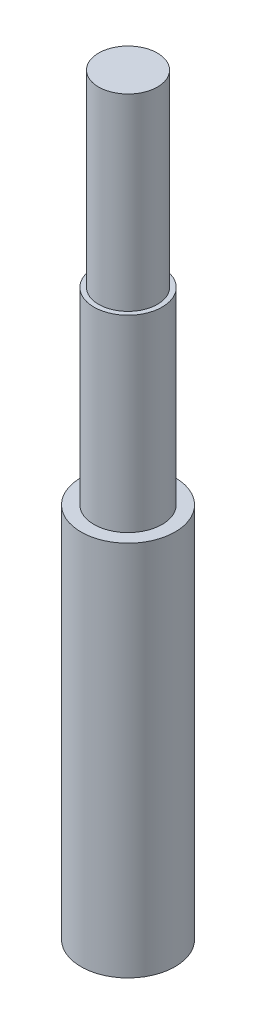
ISO-10303-21;
HEADER;
FILE_DESCRIPTION(('STEP AP214'),'2;1');
FILE_NAME('part.step','',(''),(''),'','','');
FILE_SCHEMA(('AUTOMOTIVE_DESIGN { 1 0 10303 214 1 1 1 1 }'));
ENDSEC;
DATA;
#1=APPLICATION_CONTEXT('core data for automotive mechanical design processes');
#2=APPLICATION_PROTOCOL_DEFINITION('international standard','automotive_design',2000,#1);
#3=PRODUCT_CONTEXT('',#1,'mechanical');
#4=PRODUCT('Part','Part','',(#3));
#5=PRODUCT_RELATED_PRODUCT_CATEGORY('part','',(#4));
#6=PRODUCT_DEFINITION_FORMATION('','',#4);
#7=PRODUCT_DEFINITION_CONTEXT('part definition',#1,'design');
#8=PRODUCT_DEFINITION('design','',#6,#7);
#9=PRODUCT_DEFINITION_SHAPE('','',#8);
#10=(LENGTH_UNIT() NAMED_UNIT(*) SI_UNIT(.MILLI.,.METRE.));
#11=(NAMED_UNIT(*) PLANE_ANGLE_UNIT() SI_UNIT($,.RADIAN.));
#12=(NAMED_UNIT(*) SI_UNIT($,.STERADIAN.) SOLID_ANGLE_UNIT());
#13=UNCERTAINTY_MEASURE_WITH_UNIT(LENGTH_MEASURE(1.E-05),#10,'distance_accuracy_value','');
#14=(GEOMETRIC_REPRESENTATION_CONTEXT(3) GLOBAL_UNCERTAINTY_ASSIGNED_CONTEXT((#13)) GLOBAL_UNIT_ASSIGNED_CONTEXT((#10,
#11,#12)) REPRESENTATION_CONTEXT('',''));
#15=CARTESIAN_POINT('',(0.,0.,0.));
#16=DIRECTION('',(0.,0.,1.));
#17=DIRECTION('',(1.,0.,0.));
#18=AXIS2_PLACEMENT_3D('',#15,#16,#17);
#19=CARTESIAN_POINT('',(0.,38.1,0.));
#20=DIRECTION('',(0.,-1.,0.));
#21=DIRECTION('',(0.,0.,-1.));
#22=AXIS2_PLACEMENT_3D('',#19,#20,#21);
#23=CYLINDRICAL_SURFACE('',#22,3.175);
#24=CARTESIAN_POINT('',(0.,0.,0.));
#25=DIRECTION('',(0.,1.,0.));
#26=DIRECTION('',(0.,0.,1.));
#27=AXIS2_PLACEMENT_3D('',#24,#25,#26);
#28=CIRCLE('',#27,3.175);
#29=CARTESIAN_POINT('',(0.,0.,-3.175));
#30=VERTEX_POINT('',#29);
#31=EDGE_CURVE('E39',#30,#30,#28,.T.);
#32=CARTESIAN_POINT('',(0.,25.4,0.));
#33=DIRECTION('',(0.,1.,0.));
#34=DIRECTION('',(0.,0.,1.));
#35=AXIS2_PLACEMENT_3D('',#32,#33,#34);
#36=CIRCLE('',#35,3.175);
#37=CARTESIAN_POINT('',(0.,25.4,-3.175));
#38=VERTEX_POINT('',#37);
#39=EDGE_CURVE('E35',#38,#38,#36,.T.);
#40=CARTESIAN_POINT('',(0.,0.,-3.175));
#41=CARTESIAN_POINT('',(0.,0.264583333333334,-3.175));
#42=CARTESIAN_POINT('',(0.,0.529166666666668,-3.175));
#43=CARTESIAN_POINT('',(0.,1.05833333333333,-3.175));
#44=CARTESIAN_POINT('',(0.,1.32291666666667,-3.175));
#45=CARTESIAN_POINT('',(0.,1.85208333333333,-3.175));
#46=CARTESIAN_POINT('',(0.,2.11666666666667,-3.175));
#47=CARTESIAN_POINT('',(0.,2.64583333333333,-3.175));
#48=CARTESIAN_POINT('',(0.,2.91041666666667,-3.175));
#49=CARTESIAN_POINT('',(0.,3.43958333333333,-3.175));
#50=CARTESIAN_POINT('',(0.,3.70416666666667,-3.175));
#51=CARTESIAN_POINT('',(0.,4.23333333333333,-3.175));
#52=CARTESIAN_POINT('',(0.,4.49791666666667,-3.175));
#53=CARTESIAN_POINT('',(0.,5.02708333333333,-3.175));
#54=CARTESIAN_POINT('',(0.,5.29166666666667,-3.175));
#55=CARTESIAN_POINT('',(0.,5.82083333333333,-3.175));
#56=CARTESIAN_POINT('',(0.,6.08541666666667,-3.175));
#57=CARTESIAN_POINT('',(0.,6.61458333333333,-3.175));
#58=CARTESIAN_POINT('',(0.,6.87916666666667,-3.175));
#59=CARTESIAN_POINT('',(0.,7.40833333333333,-3.175));
#60=CARTESIAN_POINT('',(0.,7.67291666666666,-3.175));
#61=CARTESIAN_POINT('',(0.,8.20208333333333,-3.175));
#62=CARTESIAN_POINT('',(0.,8.46666666666667,-3.175));
#63=CARTESIAN_POINT('',(0.,8.99583333333333,-3.175));
#64=CARTESIAN_POINT('',(0.,9.26041666666666,-3.175));
#65=CARTESIAN_POINT('',(0.,9.78958333333333,-3.175));
#66=CARTESIAN_POINT('',(0.,10.0541666666667,-3.175));
#67=CARTESIAN_POINT('',(0.,10.5833333333333,-3.175));
#68=CARTESIAN_POINT('',(0.,10.8479166666667,-3.175));
#69=CARTESIAN_POINT('',(0.,11.3770833333333,-3.175));
#70=CARTESIAN_POINT('',(0.,11.6416666666667,-3.175));
#71=CARTESIAN_POINT('',(0.,12.1708333333333,-3.175));
#72=CARTESIAN_POINT('',(0.,12.4354166666667,-3.175));
#73=CARTESIAN_POINT('',(0.,12.9645833333333,-3.175));
#74=CARTESIAN_POINT('',(0.,13.2291666666667,-3.175));
#75=CARTESIAN_POINT('',(0.,13.7583333333333,-3.175));
#76=CARTESIAN_POINT('',(0.,14.0229166666667,-3.175));
#77=CARTESIAN_POINT('',(0.,14.5520833333333,-3.175));
#78=CARTESIAN_POINT('',(0.,14.8166666666667,-3.175));
#79=CARTESIAN_POINT('',(0.,15.3458333333333,-3.175));
#80=CARTESIAN_POINT('',(0.,15.6104166666667,-3.175));
#81=CARTESIAN_POINT('',(0.,16.1395833333333,-3.175));
#82=CARTESIAN_POINT('',(0.,16.4041666666667,-3.175));
#83=CARTESIAN_POINT('',(0.,16.9333333333333,-3.175));
#84=CARTESIAN_POINT('',(0.,17.1979166666667,-3.175));
#85=CARTESIAN_POINT('',(0.,17.7270833333333,-3.175));
#86=CARTESIAN_POINT('',(0.,17.9916666666667,-3.175));
#87=CARTESIAN_POINT('',(0.,18.5208333333333,-3.175));
#88=CARTESIAN_POINT('',(0.,18.7854166666667,-3.175));
#89=CARTESIAN_POINT('',(0.,19.3145833333333,-3.175));
#90=CARTESIAN_POINT('',(0.,19.5791666666667,-3.175));
#91=CARTESIAN_POINT('',(0.,20.1083333333333,-3.175));
#92=CARTESIAN_POINT('',(0.,20.3729166666667,-3.175));
#93=CARTESIAN_POINT('',(0.,20.9020833333333,-3.175));
#94=CARTESIAN_POINT('',(0.,21.1666666666667,-3.175));
#95=CARTESIAN_POINT('',(0.,21.6958333333333,-3.175));
#96=CARTESIAN_POINT('',(0.,21.9604166666667,-3.175));
#97=CARTESIAN_POINT('',(0.,22.4895833333333,-3.175));
#98=CARTESIAN_POINT('',(0.,22.7541666666667,-3.175));
#99=CARTESIAN_POINT('',(0.,23.2833333333333,-3.175));
#100=CARTESIAN_POINT('',(0.,23.5479166666667,-3.175));
#101=CARTESIAN_POINT('',(0.,24.0770833333333,-3.175));
#102=CARTESIAN_POINT('',(0.,24.3416666666667,-3.175));
#103=CARTESIAN_POINT('',(0.,24.8708333333333,-3.175));
#104=CARTESIAN_POINT('',(0.,25.1354166666667,-3.175));
#105=CARTESIAN_POINT('',(0.,25.4,-3.175));
#106=B_SPLINE_CURVE_WITH_KNOTS('',3,(#40,#41,#42,#43,#44,#45,#46,#47,#48,#49,#50,#51,#52,#53,
#54,#55,#56,#57,#58,#59,#60,#61,#62,#63,#64,#65,#66,#67,#68,#69,#70,#71,#72,#73,#74,#75,#76,#77,
#78,#79,#80,#81,#82,#83,#84,#85,#86,#87,#88,#89,#90,#91,#92,#93,#94,#95,#96,#97,#98,#99,#100,
#101,#102,#103,#104,#105),.UNSPECIFIED.,.F.,.F.,(4,2,2,2,2,2,2,2,2,2,2,2,2,2,2,2,2,2,2,2,2,2,2,
2,2,2,2,2,2,2,2,2,4),(0.,0.793750000000003,1.5875,2.38125,3.175,3.96875,4.7625,5.55625,6.35,
7.14375,7.9375,8.73125,9.525,10.31875,11.1125,11.90625,12.7,13.49375,14.2875,15.08125,15.875,
16.66875,17.4625,18.25625,19.05,19.84375,20.6375,21.43125,22.225,23.01875,23.8125,24.60625,
25.4),.UNSPECIFIED.);
#107=EDGE_CURVE('BSEAM32',#30,#38,#106,.T.);
#108=ORIENTED_EDGE('',*,*,#31,.T.);
#109=ORIENTED_EDGE('',*,*,#39,.F.);
#110=ORIENTED_EDGE('',*,*,#107,.T.);
#111=ORIENTED_EDGE('',*,*,#107,.F.);
#112=EDGE_LOOP('',(#108,#110,#109,#111));
#113=FACE_BOUND('',#112,.T.);
#114=ADVANCED_FACE('F32',(#113),#23,.T.);
#115=CARTESIAN_POINT('',(0.,0.,0.));
#116=DIRECTION('',(0.,1.,0.));
#117=DIRECTION('',(0.,0.,1.));
#118=AXIS2_PLACEMENT_3D('',#115,#116,#117);
#119=PLANE('',#118);
#120=ORIENTED_EDGE('',*,*,#31,.F.);
#121=EDGE_LOOP('',(#120));
#122=FACE_BOUND('',#121,.T.);
#123=ADVANCED_FACE('F73',(#122),#119,.F.);
#124=CARTESIAN_POINT('',(0.,25.4,0.));
#125=DIRECTION('',(0.,1.,0.));
#126=DIRECTION('',(0.,0.,1.));
#127=AXIS2_PLACEMENT_3D('',#124,#125,#126);
#128=PLANE('',#127);
#129=CARTESIAN_POINT('',(0.,25.4,0.));
#130=DIRECTION('',(0.,1.,0.));
#131=DIRECTION('',(0.,0.,1.));
#132=AXIS2_PLACEMENT_3D('',#129,#130,#131);
#133=CIRCLE('',#132,2.3);
#134=CARTESIAN_POINT('',(0.,25.4,2.3));
#135=VERTEX_POINT('',#134);
#136=EDGE_CURVE('E47',#135,#135,#133,.T.);
#137=ORIENTED_EDGE('',*,*,#136,.F.);
#138=EDGE_LOOP('',(#137));
#139=FACE_BOUND('',#138,.T.);
#140=ORIENTED_EDGE('',*,*,#39,.T.);
#141=EDGE_LOOP('',(#140));
#142=FACE_BOUND('',#141,.T.);
#143=ADVANCED_FACE('F78',(#139,#142),#128,.T.);
#144=CARTESIAN_POINT('',(0.,25.4,0.));
#145=DIRECTION('',(0.,1.,0.));
#146=DIRECTION('',(0.,0.,1.));
#147=AXIS2_PLACEMENT_3D('',#144,#145,#146);
#148=CYLINDRICAL_SURFACE('',#147,2.3);
#149=ORIENTED_EDGE('',*,*,#136,.T.);
#150=EDGE_LOOP('',(#149));
#151=FACE_BOUND('',#150,.T.);
#152=CARTESIAN_POINT('',(0.,38.1,0.));
#153=DIRECTION('',(0.,1.,0.));
#154=DIRECTION('',(0.,0.,1.));
#155=AXIS2_PLACEMENT_3D('',#152,#153,#154);
#156=CIRCLE('',#155,2.3);
#157=CARTESIAN_POINT('',(0.,38.1,2.3));
#158=VERTEX_POINT('',#157);
#159=EDGE_CURVE('E50',#158,#158,#156,.T.);
#160=ORIENTED_EDGE('',*,*,#159,.F.);
#161=EDGE_LOOP('',(#160));
#162=FACE_BOUND('',#161,.T.);
#163=ADVANCED_FACE('F68',(#151,#162),#148,.T.);
#164=CARTESIAN_POINT('',(0.,38.1,0.));
#165=DIRECTION('',(0.,1.,0.));
#166=DIRECTION('',(0.,0.,1.));
#167=AXIS2_PLACEMENT_3D('',#164,#165,#166);
#168=PLANE('',#167);
#169=CARTESIAN_POINT('',(0.,38.1,0.));
#170=DIRECTION('',(0.,1.,0.));
#171=DIRECTION('',(0.,0.,1.));
#172=AXIS2_PLACEMENT_3D('',#169,#170,#171);
#173=CIRCLE('',#172,1.984375);
#174=CARTESIAN_POINT('',(0.,38.1,1.984375));
#175=VERTEX_POINT('',#174);
#176=EDGE_CURVE('E10',#175,#175,#173,.T.);
#177=ORIENTED_EDGE('',*,*,#176,.F.);
#178=EDGE_LOOP('',(#177));
#179=FACE_BOUND('',#178,.T.);
#180=ORIENTED_EDGE('',*,*,#159,.T.);
#181=EDGE_LOOP('',(#180));
#182=FACE_BOUND('',#181,.T.);
#183=ADVANCED_FACE('F61',(#179,#182),#168,.T.);
#184=CARTESIAN_POINT('',(0.,50.8,0.));
#185=DIRECTION('',(0.,-1.,0.));
#186=DIRECTION('',(0.,0.,-1.));
#187=AXIS2_PLACEMENT_3D('',#184,#185,#186);
#188=CYLINDRICAL_SURFACE('',#187,1.984375);
#189=CARTESIAN_POINT('',(0.,50.8,0.));
#190=DIRECTION('',(0.,1.,0.));
#191=DIRECTION('',(0.,0.,1.));
#192=AXIS2_PLACEMENT_3D('',#189,#190,#191);
#193=CIRCLE('',#192,1.984375);
#194=CARTESIAN_POINT('',(0.,50.8,1.984375));
#195=VERTEX_POINT('',#194);
#196=EDGE_CURVE('E46',#195,#195,#193,.T.);
#197=ORIENTED_EDGE('',*,*,#196,.F.);
#198=EDGE_LOOP('',(#197));
#199=FACE_BOUND('',#198,.T.);
#200=ORIENTED_EDGE('',*,*,#176,.T.);
#201=EDGE_LOOP('',(#200));
#202=FACE_BOUND('',#201,.T.);
#203=ADVANCED_FACE('F59',(#199,#202),#188,.T.);
#204=CARTESIAN_POINT('',(0.,50.8,0.));
#205=DIRECTION('',(0.,1.,0.));
#206=DIRECTION('',(0.,0.,1.));
#207=AXIS2_PLACEMENT_3D('',#204,#205,#206);
#208=PLANE('',#207);
#209=ORIENTED_EDGE('',*,*,#196,.T.);
#210=EDGE_LOOP('',(#209));
#211=FACE_BOUND('',#210,.T.);
#212=ADVANCED_FACE('F57',(#211),#208,.T.);
#213=CLOSED_SHELL('',(#114,#123,#143,#163,#183,#203,#212));
#214=MANIFOLD_SOLID_BREP('B2',#213);
#215=ADVANCED_BREP_SHAPE_REPRESENTATION('',(#18,#214),#14);
#216=SHAPE_DEFINITION_REPRESENTATION(#9,#215);
ENDSEC;
END-ISO-10303-21;
